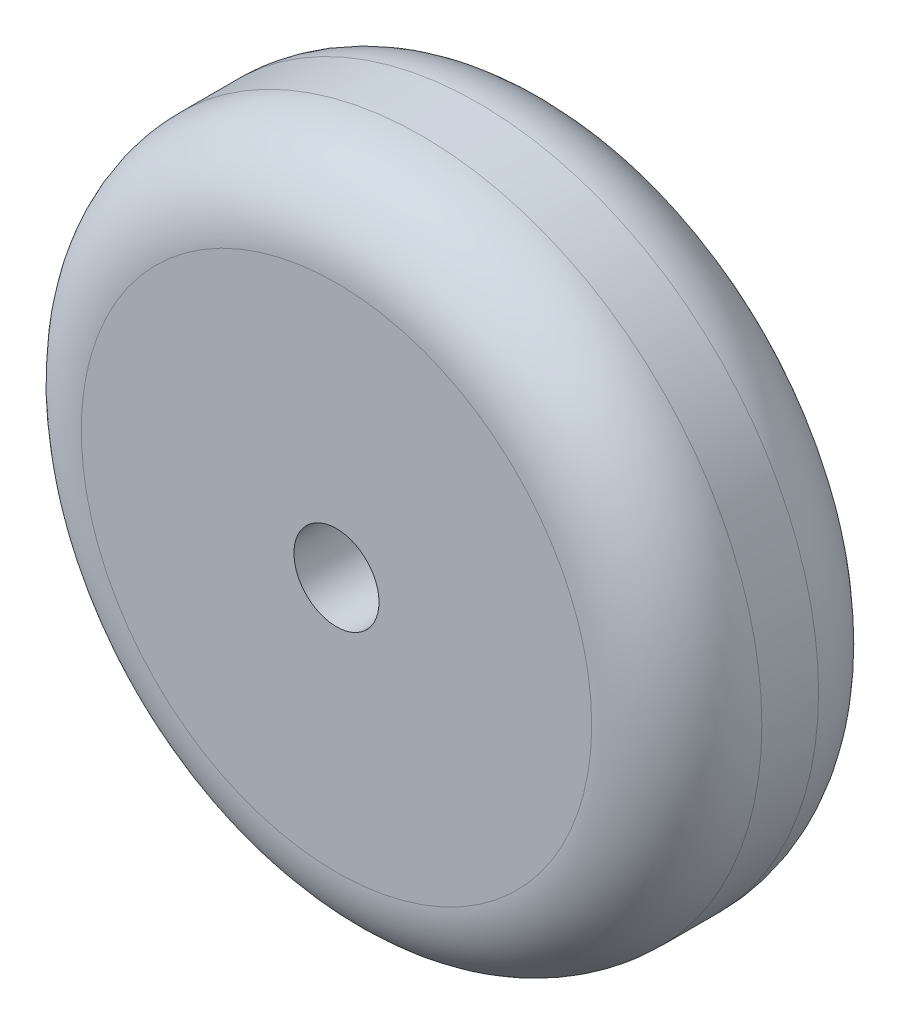
ISO-10303-21;
HEADER;
FILE_DESCRIPTION(('STEP AP214'),'2;1');
FILE_NAME('part.step','',(''),(''),'','','');
FILE_SCHEMA(('AUTOMOTIVE_DESIGN { 1 0 10303 214 1 1 1 1 }'));
ENDSEC;
DATA;
#1=APPLICATION_CONTEXT('core data for automotive mechanical design processes');
#2=APPLICATION_PROTOCOL_DEFINITION('international standard','automotive_design',2000,#1);
#3=PRODUCT_CONTEXT('',#1,'mechanical');
#4=PRODUCT('Part','Part','',(#3));
#5=PRODUCT_RELATED_PRODUCT_CATEGORY('part','',(#4));
#6=PRODUCT_DEFINITION_FORMATION('','',#4);
#7=PRODUCT_DEFINITION_CONTEXT('part definition',#1,'design');
#8=PRODUCT_DEFINITION('design','',#6,#7);
#9=PRODUCT_DEFINITION_SHAPE('','',#8);
#10=(LENGTH_UNIT() NAMED_UNIT(*) SI_UNIT(.MILLI.,.METRE.));
#11=(NAMED_UNIT(*) PLANE_ANGLE_UNIT() SI_UNIT($,.RADIAN.));
#12=(NAMED_UNIT(*) SI_UNIT($,.STERADIAN.) SOLID_ANGLE_UNIT());
#13=UNCERTAINTY_MEASURE_WITH_UNIT(LENGTH_MEASURE(1.E-05),#10,'distance_accuracy_value','');
#14=(GEOMETRIC_REPRESENTATION_CONTEXT(3) GLOBAL_UNCERTAINTY_ASSIGNED_CONTEXT((#13)) GLOBAL_UNIT_ASSIGNED_CONTEXT((#10,
#11,#12)) REPRESENTATION_CONTEXT('',''));
#15=CARTESIAN_POINT('',(0.,0.,0.));
#16=DIRECTION('',(0.,0.,1.));
#17=DIRECTION('',(1.,0.,0.));
#18=AXIS2_PLACEMENT_3D('',#15,#16,#17);
#19=CARTESIAN_POINT('',(0.,0.,2.));
#20=DIRECTION('',(0.,0.,-1.));
#21=DIRECTION('',(-1.,0.,0.));
#22=AXIS2_PLACEMENT_3D('',#19,#20,#21);
#23=CYLINDRICAL_SURFACE('',#22,6.);
#24=CARTESIAN_POINT('',(0.,0.,-0.5));
#25=DIRECTION('',(0.,0.,1.));
#26=DIRECTION('',(1.,0.,0.));
#27=AXIS2_PLACEMENT_3D('',#24,#25,#26);
#28=CIRCLE('',#27,6.);
#29=CARTESIAN_POINT('',(6.,0.,-0.5));
#30=VERTEX_POINT('',#29);
#31=EDGE_CURVE('E56',#30,#30,#28,.T.);
#32=ORIENTED_EDGE('',*,*,#31,.T.);
#33=EDGE_LOOP('',(#32));
#34=FACE_BOUND('',#33,.T.);
#35=CARTESIAN_POINT('',(0.,0.,0.5));
#36=DIRECTION('',(0.,0.,1.));
#37=DIRECTION('',(1.,0.,0.));
#38=AXIS2_PLACEMENT_3D('',#35,#36,#37);
#39=CIRCLE('',#38,6.);
#40=CARTESIAN_POINT('',(6.,0.,0.5));
#41=VERTEX_POINT('',#40);
#42=EDGE_CURVE('E61',#41,#41,#39,.F.);
#43=ORIENTED_EDGE('',*,*,#42,.T.);
#44=EDGE_LOOP('',(#43));
#45=FACE_BOUND('',#44,.T.);
#46=ADVANCED_FACE('F43',(#34,#45),#23,.T.);
#47=CARTESIAN_POINT('',(0.,0.,2.));
#48=DIRECTION('',(0.,0.,1.));
#49=DIRECTION('',(1.,0.,0.));
#50=AXIS2_PLACEMENT_3D('',#47,#48,#49);
#51=PLANE('',#50);
#52=CARTESIAN_POINT('',(0.,0.,2.));
#53=DIRECTION('',(0.,0.,1.));
#54=DIRECTION('',(1.,0.,0.));
#55=AXIS2_PLACEMENT_3D('',#52,#53,#54);
#56=CIRCLE('',#55,4.5);
#57=CARTESIAN_POINT('',(4.5,0.,2.));
#58=VERTEX_POINT('',#57);
#59=EDGE_CURVE('E10',#58,#58,#56,.T.);
#60=ORIENTED_EDGE('',*,*,#59,.T.);
#61=EDGE_LOOP('',(#60));
#62=FACE_BOUND('',#61,.T.);
#63=CARTESIAN_POINT('',(0.,0.,2.));
#64=DIRECTION('',(0.,0.,1.));
#65=DIRECTION('',(1.,0.,0.));
#66=AXIS2_PLACEMENT_3D('',#63,#64,#65);
#67=CIRCLE('',#66,0.75);
#68=CARTESIAN_POINT('',(0.75,0.,2.));
#69=VERTEX_POINT('',#68);
#70=EDGE_CURVE('E68',#69,#69,#67,.T.);
#71=ORIENTED_EDGE('',*,*,#70,.F.);
#72=EDGE_LOOP('',(#71));
#73=FACE_BOUND('',#72,.T.);
#74=ADVANCED_FACE('F85',(#62,#73),#51,.T.);
#75=CARTESIAN_POINT('',(0.,0.,-2.));
#76=DIRECTION('',(0.,0.,1.));
#77=DIRECTION('',(1.,0.,0.));
#78=AXIS2_PLACEMENT_3D('',#75,#76,#77);
#79=PLANE('',#78);
#80=CARTESIAN_POINT('',(0.,0.,-2.));
#81=DIRECTION('',(0.,0.,1.));
#82=DIRECTION('',(1.,0.,0.));
#83=AXIS2_PLACEMENT_3D('',#80,#81,#82);
#84=CIRCLE('',#83,4.5);
#85=CARTESIAN_POINT('',(4.5,0.,-2.));
#86=VERTEX_POINT('',#85);
#87=EDGE_CURVE('E51',#86,#86,#84,.F.);
#88=ORIENTED_EDGE('',*,*,#87,.T.);
#89=EDGE_LOOP('',(#88));
#90=FACE_BOUND('',#89,.T.);
#91=CARTESIAN_POINT('',(0.,0.,-2.));
#92=DIRECTION('',(0.,0.,1.));
#93=DIRECTION('',(1.,0.,0.));
#94=AXIS2_PLACEMENT_3D('',#91,#92,#93);
#95=CIRCLE('',#94,0.75);
#96=CARTESIAN_POINT('',(0.75,0.,-2.));
#97=VERTEX_POINT('',#96);
#98=EDGE_CURVE('E67',#97,#97,#95,.T.);
#99=ORIENTED_EDGE('',*,*,#98,.T.);
#100=EDGE_LOOP('',(#99));
#101=FACE_BOUND('',#100,.T.);
#102=ADVANCED_FACE('F76',(#90,#101),#79,.F.);
#103=CARTESIAN_POINT('',(0.,0.,-2.));
#104=DIRECTION('',(0.,0.,1.));
#105=DIRECTION('',(1.,0.,0.));
#106=AXIS2_PLACEMENT_3D('',#103,#104,#105);
#107=CYLINDRICAL_SURFACE('',#106,0.75);
#108=ORIENTED_EDGE('',*,*,#98,.F.);
#109=EDGE_LOOP('',(#108));
#110=FACE_BOUND('',#109,.T.);
#111=ORIENTED_EDGE('',*,*,#70,.T.);
#112=EDGE_LOOP('',(#111));
#113=FACE_BOUND('',#112,.T.);
#114=ADVANCED_FACE('F78',(#110,#113),#107,.F.);
#115=CARTESIAN_POINT('',(0.,0.,-0.5));
#116=DIRECTION('',(0.,0.,1.));
#117=DIRECTION('',(1.,0.,0.));
#118=AXIS2_PLACEMENT_3D('',#115,#116,#117);
#119=TOROIDAL_SURFACE('',#118,4.5,1.5);
#120=ORIENTED_EDGE('',*,*,#87,.F.);
#121=EDGE_LOOP('',(#120));
#122=FACE_BOUND('',#121,.T.);
#123=ORIENTED_EDGE('',*,*,#31,.F.);
#124=EDGE_LOOP('',(#123));
#125=FACE_BOUND('',#124,.T.);
#126=ADVANCED_FACE('F81',(#122,#125),#119,.T.);
#127=CARTESIAN_POINT('',(0.,0.,0.5));
#128=DIRECTION('',(0.,0.,1.));
#129=DIRECTION('',(1.,0.,0.));
#130=AXIS2_PLACEMENT_3D('',#127,#128,#129);
#131=TOROIDAL_SURFACE('',#130,4.5,1.5);
#132=ORIENTED_EDGE('',*,*,#42,.F.);
#133=EDGE_LOOP('',(#132));
#134=FACE_BOUND('',#133,.T.);
#135=ORIENTED_EDGE('',*,*,#59,.F.);
#136=EDGE_LOOP('',(#135));
#137=FACE_BOUND('',#136,.T.);
#138=ADVANCED_FACE('F45',(#134,#137),#131,.T.);
#139=CLOSED_SHELL('',(#46,#74,#102,#114,#126,#138));
#140=MANIFOLD_SOLID_BREP('B2',#139);
#141=ADVANCED_BREP_SHAPE_REPRESENTATION('',(#18,#140),#14);
#142=SHAPE_DEFINITION_REPRESENTATION(#9,#141);
ENDSEC;
END-ISO-10303-21;
